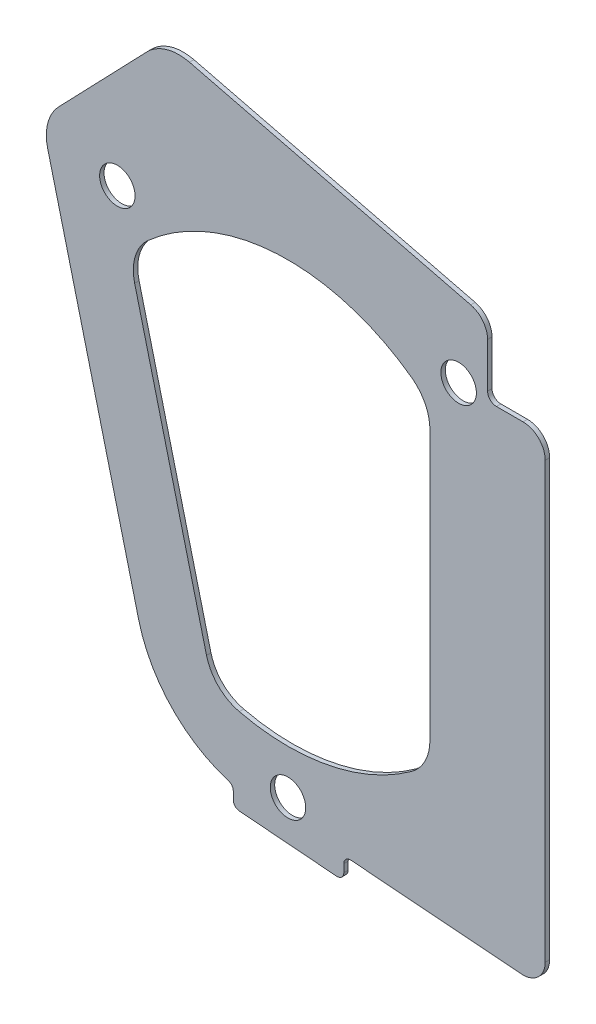
ISO-10303-21;
HEADER;
FILE_DESCRIPTION(('STEP AP214'),'2;1');
FILE_NAME('part.step','',(''),(''),'','','');
FILE_SCHEMA(('AUTOMOTIVE_DESIGN { 1 0 10303 214 1 1 1 1 }'));
ENDSEC;
DATA;
#1=APPLICATION_CONTEXT('core data for automotive mechanical design processes');
#2=APPLICATION_PROTOCOL_DEFINITION('international standard','automotive_design',2000,#1);
#3=PRODUCT_CONTEXT('',#1,'mechanical');
#4=PRODUCT('Part','Part','',(#3));
#5=PRODUCT_RELATED_PRODUCT_CATEGORY('part','',(#4));
#6=PRODUCT_DEFINITION_FORMATION('','',#4);
#7=PRODUCT_DEFINITION_CONTEXT('part definition',#1,'design');
#8=PRODUCT_DEFINITION('design','',#6,#7);
#9=PRODUCT_DEFINITION_SHAPE('','',#8);
#10=(LENGTH_UNIT() NAMED_UNIT(*) SI_UNIT(.MILLI.,.METRE.));
#11=(NAMED_UNIT(*) PLANE_ANGLE_UNIT() SI_UNIT($,.RADIAN.));
#12=(NAMED_UNIT(*) SI_UNIT($,.STERADIAN.) SOLID_ANGLE_UNIT());
#13=UNCERTAINTY_MEASURE_WITH_UNIT(LENGTH_MEASURE(1.E-05),#10,'distance_accuracy_value','');
#14=(GEOMETRIC_REPRESENTATION_CONTEXT(3) GLOBAL_UNCERTAINTY_ASSIGNED_CONTEXT((#13)) GLOBAL_UNIT_ASSIGNED_CONTEXT((#10,
#11,#12)) REPRESENTATION_CONTEXT('',''));
#15=CARTESIAN_POINT('',(0.,0.,0.));
#16=DIRECTION('',(0.,0.,1.));
#17=DIRECTION('',(1.,0.,0.));
#18=AXIS2_PLACEMENT_3D('',#15,#16,#17);
#19=CARTESIAN_POINT('',(-4.57536444130157,-32.2653428300318,1.));
#20=DIRECTION('',(0.,0.,1.));
#21=DIRECTION('',(1.,0.,0.));
#22=AXIS2_PLACEMENT_3D('',#19,#20,#21);
#23=PLANE('',#22);
#24=CARTESIAN_POINT('',(-38.4750098656341,42.7308274649504,1.));
#25=DIRECTION('',(0.,0.,1.));
#26=DIRECTION('',(1.,0.,0.));
#27=AXIS2_PLACEMENT_3D('',#24,#25,#26);
#28=CIRCLE('',#27,4.);
#29=CARTESIAN_POINT('',(-34.4750098656341,42.7308274649504,1.));
#30=VERTEX_POINT('',#29);
#31=EDGE_CURVE('E298',#30,#30,#28,.T.);
#32=ORIENTED_EDGE('',*,*,#31,.F.);
#33=EDGE_LOOP('',(#32));
#34=FACE_BOUND('',#33,.T.);
#35=CARTESIAN_POINT('',(-4.57536444130157,-32.2653428300318,1.));
#36=DIRECTION('',(0.,0.,1.));
#37=DIRECTION('',(1.,0.,0.));
#38=AXIS2_PLACEMENT_3D('',#35,#36,#37);
#39=CIRCLE('',#38,30.);
#40=CARTESIAN_POINT('',(-33.6726776296201,-39.5692024412857,1.));
#41=VERTEX_POINT('',#40);
#42=CARTESIAN_POINT('',(-13.3987657299449,-60.9384589791281,1.));
#43=VERTEX_POINT('',#42);
#44=EDGE_CURVE('E310',#41,#43,#39,.T.);
#45=ORIENTED_EDGE('',*,*,#44,.T.);
#46=CARTESIAN_POINT('',(-13.8399357943771,-62.3721147865829,1.));
#47=DIRECTION('',(0.,0.,-1.));
#48=DIRECTION('',(1.,0.,0.));
#49=AXIS2_PLACEMENT_3D('',#46,#47,#48);
#50=CIRCLE('',#49,1.49999999999999);
#51=CARTESIAN_POINT('',(-12.3399357943771,-62.3721147865829,1.));
#52=VERTEX_POINT('',#51);
#53=EDGE_CURVE('E313',#43,#52,#50,.T.);
#54=ORIENTED_EDGE('',*,*,#53,.T.);
#55=DIRECTION('',(0.,-1.,0.));
#56=VECTOR('',#55,1.);
#57=CARTESIAN_POINT('',(-12.3399357943771,-62.3721147865829,1.));
#58=LINE('',#57,#56);
#59=CARTESIAN_POINT('',(-12.3399357943771,-64.1251935577605,1.));
#60=VERTEX_POINT('',#59);
#61=EDGE_CURVE('E316',#52,#60,#58,.T.);
#62=ORIENTED_EDGE('',*,*,#61,.T.);
#63=CARTESIAN_POINT('',(-10.8399357943771,-64.1251935577605,1.));
#64=DIRECTION('',(0.,0.,1.));
#65=DIRECTION('',(1.,0.,0.));
#66=AXIS2_PLACEMENT_3D('',#63,#64,#65);
#67=CIRCLE('',#66,1.5);
#68=CARTESIAN_POINT('',(-10.9599357943771,-65.6203858530858,1.));
#69=VERTEX_POINT('',#68);
#70=EDGE_CURVE('E318',#60,#69,#67,.T.);
#71=ORIENTED_EDGE('',*,*,#70,.T.);
#72=DIRECTION('',(0.996794863550169,-0.0800000000000001,0.));
#73=VECTOR('',#72,1.);
#74=CARTESIAN_POINT('',(-10.9599357943771,-65.6203858530858,1.));
#75=LINE('',#74,#73);
#76=CARTESIAN_POINT('',(10.9599357943771,-67.3796141469142,1.));
#77=VERTEX_POINT('',#76);
#78=EDGE_CURVE('E320',#69,#77,#75,.T.);
#79=ORIENTED_EDGE('',*,*,#78,.T.);
#80=CARTESIAN_POINT('',(11.0799357943771,-65.884421851589,1.));
#81=DIRECTION('',(0.,0.,1.));
#82=DIRECTION('',(1.,0.,0.));
#83=AXIS2_PLACEMENT_3D('',#80,#81,#82);
#84=CIRCLE('',#83,1.50000000000001);
#85=CARTESIAN_POINT('',(12.5799357943771,-65.884421851589,1.));
#86=VERTEX_POINT('',#85);
#87=EDGE_CURVE('E322',#77,#86,#84,.T.);
#88=ORIENTED_EDGE('',*,*,#87,.T.);
#89=DIRECTION('',(0.,1.,0.));
#90=VECTOR('',#89,1.);
#91=CARTESIAN_POINT('',(12.5799357943771,-65.884421851589,1.));
#92=LINE('',#91,#90);
#93=CARTESIAN_POINT('',(12.5799357943771,-64.1313430804113,1.));
#94=VERTEX_POINT('',#93);
#95=EDGE_CURVE('E324',#86,#94,#92,.T.);
#96=ORIENTED_EDGE('',*,*,#95,.T.);
#97=CARTESIAN_POINT('',(14.0799357943771,-64.1313430804113,1.));
#98=DIRECTION('',(0.,0.,-1.));
#99=DIRECTION('',(-1.,0.,0.));
#100=AXIS2_PLACEMENT_3D('',#97,#98,#99);
#101=CIRCLE('',#100,1.5);
#102=CARTESIAN_POINT('',(14.1967250422869,-62.6358965679701,1.));
#103=VERTEX_POINT('',#102);
#104=EDGE_CURVE('E326',#94,#103,#101,.T.);
#105=ORIENTED_EDGE('',*,*,#104,.T.);
#106=DIRECTION('',(0.996964341627493,-0.0778594986065279,0.));
#107=VECTOR('',#106,1.);
#108=CARTESIAN_POINT('',(14.1967250422869,-62.6358965679701,1.));
#109=LINE('',#108,#107);
#110=CARTESIAN_POINT('',(52.6107025069674,-65.6358965679701,1.));
#111=VERTEX_POINT('',#110);
#112=EDGE_CURVE('E328',#103,#111,#109,.T.);
#113=ORIENTED_EDGE('',*,*,#112,.T.);
#114=CARTESIAN_POINT('',(53.,-60.6510748598326,1.));
#115=DIRECTION('',(0.,0.,1.));
#116=DIRECTION('',(1.,0.,0.));
#117=AXIS2_PLACEMENT_3D('',#114,#115,#116);
#118=CIRCLE('',#117,5.);
#119=CARTESIAN_POINT('',(58.,-60.6510748598326,1.));
#120=VERTEX_POINT('',#119);
#121=EDGE_CURVE('E330',#111,#120,#118,.T.);
#122=ORIENTED_EDGE('',*,*,#121,.T.);
#123=DIRECTION('',(0.,1.,0.));
#124=VECTOR('',#123,1.);
#125=CARTESIAN_POINT('',(58.,-60.6510748598326,1.));
#126=LINE('',#125,#124);
#127=CARTESIAN_POINT('',(58.,37.3641034320299,1.));
#128=VERTEX_POINT('',#127);
#129=EDGE_CURVE('E332',#120,#128,#126,.T.);
#130=ORIENTED_EDGE('',*,*,#129,.T.);
#131=CARTESIAN_POINT('',(53.,37.3641034320299,1.));
#132=DIRECTION('',(0.,0.,1.));
#133=DIRECTION('',(1.,0.,0.));
#134=AXIS2_PLACEMENT_3D('',#131,#132,#133);
#135=CIRCLE('',#134,5.);
#136=CARTESIAN_POINT('',(53.,42.3641034320299,1.));
#137=VERTEX_POINT('',#136);
#138=EDGE_CURVE('E334',#128,#137,#135,.T.);
#139=ORIENTED_EDGE('',*,*,#138,.T.);
#140=DIRECTION('',(-1.,0.,0.));
#141=VECTOR('',#140,1.);
#142=CARTESIAN_POINT('',(53.,42.3641034320299,1.));
#143=LINE('',#142,#141);
#144=CARTESIAN_POINT('',(47.,42.3641034320299,1.));
#145=VERTEX_POINT('',#144);
#146=EDGE_CURVE('E336',#137,#145,#143,.T.);
#147=ORIENTED_EDGE('',*,*,#146,.T.);
#148=CARTESIAN_POINT('',(47.,44.3641034320299,1.));
#149=DIRECTION('',(0.,0.,-1.));
#150=DIRECTION('',(-1.,0.,0.));
#151=AXIS2_PLACEMENT_3D('',#148,#149,#150);
#152=CIRCLE('',#151,2.);
#153=CARTESIAN_POINT('',(45.,44.3641034320299,1.));
#154=VERTEX_POINT('',#153);
#155=EDGE_CURVE('E338',#145,#154,#152,.T.);
#156=ORIENTED_EDGE('',*,*,#155,.T.);
#157=DIRECTION('',(0.,1.,0.));
#158=VECTOR('',#157,1.);
#159=CARTESIAN_POINT('',(45.,44.3641034320299,1.));
#160=LINE('',#159,#158);
#161=CARTESIAN_POINT('',(45.,54.4496966257359,1.));
#162=VERTEX_POINT('',#161);
#163=EDGE_CURVE('E340',#154,#162,#160,.T.);
#164=ORIENTED_EDGE('',*,*,#163,.T.);
#165=CARTESIAN_POINT('',(40.,54.4496966257359,1.));
#166=DIRECTION('',(0.,0.,1.));
#167=DIRECTION('',(1.,0.,0.));
#168=AXIS2_PLACEMENT_3D('',#165,#166,#167);
#169=CIRCLE('',#168,5.);
#170=CARTESIAN_POINT('',(41.2,59.3035610655405,1.));
#171=VERTEX_POINT('',#170);
#172=EDGE_CURVE('E342',#162,#171,#169,.T.);
#173=ORIENTED_EDGE('',*,*,#172,.T.);
#174=DIRECTION('',(-0.970772887960928,0.24,0.));
#175=VECTOR('',#174,1.);
#176=CARTESIAN_POINT('',(41.2,59.3035610655405,1.));
#177=LINE('',#176,#175);
#178=CARTESIAN_POINT('',(-22.2032067152073,74.9784627859748,1.));
#179=VERTEX_POINT('',#178);
#180=EDGE_CURVE('E344',#171,#179,#177,.T.);
#181=ORIENTED_EDGE('',*,*,#180,.T.);
#182=CARTESIAN_POINT('',(-24.6032067152072,65.2707339063655,1.));
#183=DIRECTION('',(0.,0.,1.));
#184=DIRECTION('',(1.,0.,0.));
#185=AXIS2_PLACEMENT_3D('',#182,#183,#184);
#186=CIRCLE('',#185,10.);
#187=CARTESIAN_POINT('',(-31.8103465380008,72.2030593152528,1.));
#188=VERTEX_POINT('',#187);
#189=EDGE_CURVE('E346',#179,#188,#186,.T.);
#190=ORIENTED_EDGE('',*,*,#189,.T.);
#191=DIRECTION('',(-0.693232540888727,-0.72071398227935,0.));
#192=VECTOR('',#191,1.);
#193=CARTESIAN_POINT('',(-31.8103465380008,72.2030593152528,1.));
#194=LINE('',#193,#192);
#195=CARTESIAN_POINT('',(-51.6963966633559,51.5286772972396,1.));
#196=VERTEX_POINT('',#195);
#197=EDGE_CURVE('E348',#188,#196,#194,.T.);
#198=ORIENTED_EDGE('',*,*,#197,.T.);
#199=CARTESIAN_POINT('',(-44.4892568405624,44.5963518883524,1.));
#200=DIRECTION('',(0.,0.,1.));
#201=DIRECTION('',(1.,0.,0.));
#202=AXIS2_PLACEMENT_3D('',#199,#200,#201);
#203=CIRCLE('',#202,10.);
#204=CARTESIAN_POINT('',(-54.1883612366686,42.1617320179344,1.));
#205=VERTEX_POINT('',#204);
#206=EDGE_CURVE('E350',#196,#205,#203,.T.);
#207=ORIENTED_EDGE('',*,*,#206,.T.);
#208=DIRECTION('',(0.243461987041799,-0.969910439610616,0.));
#209=VECTOR('',#208,1.);
#210=CARTESIAN_POINT('',(-54.1883612366686,42.1617320179344,1.));
#211=LINE('',#210,#209);
#212=EDGE_CURVE('E352',#205,#41,#211,.T.);
#213=ORIENTED_EDGE('',*,*,#212,.T.);
#214=EDGE_LOOP('',(#45,#54,#62,#71,#79,#88,#96,#105,#113,#122,#130,#139,#147,#156,#164,#173,
#181,#190,#198,#207,#213));
#215=FACE_BOUND('',#214,.T.);
#216=CARTESIAN_POINT('',(0.,-57.5,1.));
#217=DIRECTION('',(0.,0.,1.));
#218=DIRECTION('',(1.,0.,0.));
#219=AXIS2_PLACEMENT_3D('',#216,#217,#218);
#220=CIRCLE('',#219,4.);
#221=CARTESIAN_POINT('',(4.,-57.5,1.));
#222=VERTEX_POINT('',#221);
#223=EDGE_CURVE('E304',#222,#222,#220,.T.);
#224=ORIENTED_EDGE('',*,*,#223,.F.);
#225=EDGE_LOOP('',(#224));
#226=FACE_BOUND('',#225,.T.);
#227=CARTESIAN_POINT('',(38.4750098656341,42.7308274649504,1.));
#228=DIRECTION('',(0.,0.,1.));
#229=DIRECTION('',(1.,0.,0.));
#230=AXIS2_PLACEMENT_3D('',#227,#228,#229);
#231=CIRCLE('',#230,4.00000000000001);
#232=CARTESIAN_POINT('',(42.4750098656341,42.7308274649504,1.));
#233=VERTEX_POINT('',#232);
#234=EDGE_CURVE('E292',#233,#233,#231,.T.);
#235=ORIENTED_EDGE('',*,*,#234,.F.);
#236=EDGE_LOOP('',(#235));
#237=FACE_BOUND('',#236,.T.);
#238=DIRECTION('',(0.,1.,0.));
#239=VECTOR('',#238,1.);
#240=CARTESIAN_POINT('',(32.,30.3685692781204,1.));
#241=LINE('',#240,#239);
#242=CARTESIAN_POINT('',(32.,-30.3685692781204,1.));
#243=VERTEX_POINT('',#242);
#244=CARTESIAN_POINT('',(32.,30.3685692781204,1.));
#245=VERTEX_POINT('',#244);
#246=EDGE_CURVE('E235',#243,#245,#241,.T.);
#247=ORIENTED_EDGE('',*,*,#246,.F.);
#248=CARTESIAN_POINT('',(22.,-30.3685692781204,1.));
#249=DIRECTION('',(0.,0.,1.));
#250=DIRECTION('',(-1.,0.,0.));
#251=AXIS2_PLACEMENT_3D('',#248,#249,#250);
#252=CIRCLE('',#251,10.);
#253=CARTESIAN_POINT('',(27.8666666666667,-38.4668544189525,1.));
#254=VERTEX_POINT('',#253);
#255=EDGE_CURVE('E227',#254,#243,#252,.T.);
#256=ORIENTED_EDGE('',*,*,#255,.F.);
#257=CARTESIAN_POINT('',(0.,0.,1.));
#258=DIRECTION('',(0.,0.,1.));
#259=DIRECTION('',(1.,0.,0.));
#260=AXIS2_PLACEMENT_3D('',#257,#258,#259);
#261=CIRCLE('',#260,47.5);
#262=CARTESIAN_POINT('',(-10.9840713129822,-46.2125543266256,1.));
#263=VERTEX_POINT('',#262);
#264=EDGE_CURVE('E260',#263,#254,#261,.T.);
#265=ORIENTED_EDGE('',*,*,#264,.F.);
#266=CARTESIAN_POINT('',(-8.67163524709119,-36.4835955210202,1.));
#267=DIRECTION('',(0.,0.,1.));
#268=DIRECTION('',(1.,0.,0.));
#269=AXIS2_PLACEMENT_3D('',#266,#267,#268);
#270=CIRCLE('',#269,10.);
#271=CARTESIAN_POINT('',(-18.3707396431974,-38.9182153914382,1.));
#272=VERTEX_POINT('',#271);
#273=EDGE_CURVE('E258',#272,#263,#270,.T.);
#274=ORIENTED_EDGE('',*,*,#273,.F.);
#275=DIRECTION('',(0.243461987041799,-0.969910439610616,0.));
#276=VECTOR('',#275,1.);
#277=CARTESIAN_POINT('',(-34.5729433357523,25.6285612821981,1.));
#278=LINE('',#277,#276);
#279=CARTESIAN_POINT('',(-34.5729433357523,25.628561282198,1.));
#280=VERTEX_POINT('',#279);
#281=EDGE_CURVE('E256',#280,#272,#278,.T.);
#282=ORIENTED_EDGE('',*,*,#281,.F.);
#283=CARTESIAN_POINT('',(-24.8738389396461,28.063181152616,1.));
#284=DIRECTION('',(0.,0.,1.));
#285=DIRECTION('',(-1.,0.,0.));
#286=AXIS2_PLACEMENT_3D('',#283,#284,#285);
#287=CIRCLE('',#286,10.);
#288=CARTESIAN_POINT('',(-31.5068626568851,35.546696126647,1.));
#289=VERTEX_POINT('',#288);
#290=EDGE_CURVE('E254',#289,#280,#287,.T.);
#291=ORIENTED_EDGE('',*,*,#290,.F.);
#292=CARTESIAN_POINT('',(0.,0.,1.));
#293=DIRECTION('',(0.,0.,1.));
#294=DIRECTION('',(1.,0.,0.));
#295=AXIS2_PLACEMENT_3D('',#292,#293,#294);
#296=CIRCLE('',#295,47.5);
#297=CARTESIAN_POINT('',(27.8666666666667,38.4668544189525,1.));
#298=VERTEX_POINT('',#297);
#299=EDGE_CURVE('E250',#298,#289,#296,.T.);
#300=ORIENTED_EDGE('',*,*,#299,.F.);
#301=CARTESIAN_POINT('',(22.,30.3685692781204,1.));
#302=DIRECTION('',(0.,0.,1.));
#303=DIRECTION('',(1.,0.,0.));
#304=AXIS2_PLACEMENT_3D('',#301,#302,#303);
#305=CIRCLE('',#304,10.);
#306=EDGE_CURVE('E248',#245,#298,#305,.T.);
#307=ORIENTED_EDGE('',*,*,#306,.F.);
#308=EDGE_LOOP('',(#247,#256,#265,#274,#282,#291,#300,#307));
#309=FACE_BOUND('',#308,.T.);
#310=ADVANCED_FACE('F36',(#34,#215,#226,#237,#309),#23,.T.);
#311=CARTESIAN_POINT('',(-4.57536444130157,-32.2653428300318,0.));
#312=DIRECTION('',(0.,0.,1.));
#313=DIRECTION('',(1.,0.,0.));
#314=AXIS2_PLACEMENT_3D('',#311,#312,#313);
#315=PLANE('',#314);
#316=CARTESIAN_POINT('',(38.4750098656341,42.7308274649504,0.));
#317=DIRECTION('',(0.,0.,1.));
#318=DIRECTION('',(1.,0.,0.));
#319=AXIS2_PLACEMENT_3D('',#316,#317,#318);
#320=CIRCLE('',#319,4.00000000000001);
#321=CARTESIAN_POINT('',(42.4750098656341,42.7308274649504,0.));
#322=VERTEX_POINT('',#321);
#323=EDGE_CURVE('E243',#322,#322,#320,.T.);
#324=ORIENTED_EDGE('',*,*,#323,.T.);
#325=EDGE_LOOP('',(#324));
#326=FACE_BOUND('',#325,.T.);
#327=CARTESIAN_POINT('',(-38.4750098656341,42.7308274649504,0.));
#328=DIRECTION('',(0.,0.,1.));
#329=DIRECTION('',(1.,0.,0.));
#330=AXIS2_PLACEMENT_3D('',#327,#328,#329);
#331=CIRCLE('',#330,4.);
#332=CARTESIAN_POINT('',(-34.4750098656341,42.7308274649504,0.));
#333=VERTEX_POINT('',#332);
#334=EDGE_CURVE('E295',#333,#333,#331,.T.);
#335=ORIENTED_EDGE('',*,*,#334,.T.);
#336=EDGE_LOOP('',(#335));
#337=FACE_BOUND('',#336,.T.);
#338=CARTESIAN_POINT('',(0.,-57.5,0.));
#339=DIRECTION('',(0.,0.,1.));
#340=DIRECTION('',(1.,0.,0.));
#341=AXIS2_PLACEMENT_3D('',#338,#339,#340);
#342=CIRCLE('',#341,4.);
#343=CARTESIAN_POINT('',(4.,-57.5,0.));
#344=VERTEX_POINT('',#343);
#345=EDGE_CURVE('E301',#344,#344,#342,.T.);
#346=ORIENTED_EDGE('',*,*,#345,.T.);
#347=EDGE_LOOP('',(#346));
#348=FACE_BOUND('',#347,.T.);
#349=CARTESIAN_POINT('',(-4.57536444130157,-32.2653428300318,0.));
#350=DIRECTION('',(0.,0.,1.));
#351=DIRECTION('',(1.,0.,0.));
#352=AXIS2_PLACEMENT_3D('',#349,#350,#351);
#353=CIRCLE('',#352,30.);
#354=CARTESIAN_POINT('',(-33.6726776296201,-39.5692024412857,0.));
#355=VERTEX_POINT('',#354);
#356=CARTESIAN_POINT('',(-13.3987657299449,-60.9384589791281,0.));
#357=VERTEX_POINT('',#356);
#358=EDGE_CURVE('E307',#355,#357,#353,.T.);
#359=ORIENTED_EDGE('',*,*,#358,.F.);
#360=DIRECTION('',(0.243461987041799,-0.969910439610616,0.));
#361=VECTOR('',#360,1.);
#362=CARTESIAN_POINT('',(-54.1883612366686,42.1617320179344,0.));
#363=LINE('',#362,#361);
#364=CARTESIAN_POINT('',(-54.1883612366686,42.1617320179344,0.));
#365=VERTEX_POINT('',#364);
#366=EDGE_CURVE('E314',#365,#355,#363,.T.);
#367=ORIENTED_EDGE('',*,*,#366,.F.);
#368=CARTESIAN_POINT('',(-44.4892568405624,44.5963518883524,0.));
#369=DIRECTION('',(0.,0.,1.));
#370=DIRECTION('',(1.,0.,0.));
#371=AXIS2_PLACEMENT_3D('',#368,#369,#370);
#372=CIRCLE('',#371,10.);
#373=CARTESIAN_POINT('',(-51.6963966633559,51.5286772972396,0.));
#374=VERTEX_POINT('',#373);
#375=EDGE_CURVE('E393',#374,#365,#372,.T.);
#376=ORIENTED_EDGE('',*,*,#375,.F.);
#377=DIRECTION('',(-0.693232540888727,-0.72071398227935,0.));
#378=VECTOR('',#377,1.);
#379=CARTESIAN_POINT('',(-31.8103465380008,72.2030593152528,0.));
#380=LINE('',#379,#378);
#381=CARTESIAN_POINT('',(-31.8103465380008,72.2030593152528,0.));
#382=VERTEX_POINT('',#381);
#383=EDGE_CURVE('E391',#382,#374,#380,.T.);
#384=ORIENTED_EDGE('',*,*,#383,.F.);
#385=CARTESIAN_POINT('',(-24.6032067152072,65.2707339063655,0.));
#386=DIRECTION('',(0.,0.,1.));
#387=DIRECTION('',(1.,0.,0.));
#388=AXIS2_PLACEMENT_3D('',#385,#386,#387);
#389=CIRCLE('',#388,10.);
#390=CARTESIAN_POINT('',(-22.2032067152073,74.9784627859748,0.));
#391=VERTEX_POINT('',#390);
#392=EDGE_CURVE('E389',#391,#382,#389,.T.);
#393=ORIENTED_EDGE('',*,*,#392,.F.);
#394=DIRECTION('',(-0.970772887960928,0.24,0.));
#395=VECTOR('',#394,1.);
#396=CARTESIAN_POINT('',(41.2,59.3035610655405,0.));
#397=LINE('',#396,#395);
#398=CARTESIAN_POINT('',(41.2,59.3035610655405,0.));
#399=VERTEX_POINT('',#398);
#400=EDGE_CURVE('E387',#399,#391,#397,.T.);
#401=ORIENTED_EDGE('',*,*,#400,.F.);
#402=CARTESIAN_POINT('',(40.,54.4496966257359,0.));
#403=DIRECTION('',(0.,0.,1.));
#404=DIRECTION('',(1.,0.,0.));
#405=AXIS2_PLACEMENT_3D('',#402,#403,#404);
#406=CIRCLE('',#405,5.);
#407=CARTESIAN_POINT('',(45.,54.4496966257359,0.));
#408=VERTEX_POINT('',#407);
#409=EDGE_CURVE('E385',#408,#399,#406,.T.);
#410=ORIENTED_EDGE('',*,*,#409,.F.);
#411=DIRECTION('',(0.,1.,0.));
#412=VECTOR('',#411,1.);
#413=CARTESIAN_POINT('',(45.,44.3641034320299,0.));
#414=LINE('',#413,#412);
#415=CARTESIAN_POINT('',(45.,44.3641034320299,0.));
#416=VERTEX_POINT('',#415);
#417=EDGE_CURVE('E383',#416,#408,#414,.T.);
#418=ORIENTED_EDGE('',*,*,#417,.F.);
#419=CARTESIAN_POINT('',(47.,44.3641034320299,0.));
#420=DIRECTION('',(0.,0.,-1.));
#421=DIRECTION('',(-1.,0.,0.));
#422=AXIS2_PLACEMENT_3D('',#419,#420,#421);
#423=CIRCLE('',#422,2.);
#424=CARTESIAN_POINT('',(47.,42.3641034320299,0.));
#425=VERTEX_POINT('',#424);
#426=EDGE_CURVE('E381',#425,#416,#423,.T.);
#427=ORIENTED_EDGE('',*,*,#426,.F.);
#428=DIRECTION('',(-1.,0.,0.));
#429=VECTOR('',#428,1.);
#430=CARTESIAN_POINT('',(53.,42.3641034320299,0.));
#431=LINE('',#430,#429);
#432=CARTESIAN_POINT('',(53.,42.3641034320299,0.));
#433=VERTEX_POINT('',#432);
#434=EDGE_CURVE('E379',#433,#425,#431,.T.);
#435=ORIENTED_EDGE('',*,*,#434,.F.);
#436=CARTESIAN_POINT('',(53.,37.3641034320299,0.));
#437=DIRECTION('',(0.,0.,1.));
#438=DIRECTION('',(1.,0.,0.));
#439=AXIS2_PLACEMENT_3D('',#436,#437,#438);
#440=CIRCLE('',#439,5.);
#441=CARTESIAN_POINT('',(58.,37.3641034320299,0.));
#442=VERTEX_POINT('',#441);
#443=EDGE_CURVE('E377',#442,#433,#440,.T.);
#444=ORIENTED_EDGE('',*,*,#443,.F.);
#445=DIRECTION('',(0.,1.,0.));
#446=VECTOR('',#445,1.);
#447=CARTESIAN_POINT('',(58.,-60.6510748598326,0.));
#448=LINE('',#447,#446);
#449=CARTESIAN_POINT('',(58.,-60.6510748598326,0.));
#450=VERTEX_POINT('',#449);
#451=EDGE_CURVE('E375',#450,#442,#448,.T.);
#452=ORIENTED_EDGE('',*,*,#451,.F.);
#453=CARTESIAN_POINT('',(53.,-60.6510748598326,0.));
#454=DIRECTION('',(0.,0.,1.));
#455=DIRECTION('',(1.,0.,0.));
#456=AXIS2_PLACEMENT_3D('',#453,#454,#455);
#457=CIRCLE('',#456,5.);
#458=CARTESIAN_POINT('',(52.6107025069674,-65.6358965679701,0.));
#459=VERTEX_POINT('',#458);
#460=EDGE_CURVE('E373',#459,#450,#457,.T.);
#461=ORIENTED_EDGE('',*,*,#460,.F.);
#462=DIRECTION('',(0.996964341627493,-0.0778594986065279,0.));
#463=VECTOR('',#462,1.);
#464=CARTESIAN_POINT('',(14.1967250422869,-62.6358965679701,0.));
#465=LINE('',#464,#463);
#466=CARTESIAN_POINT('',(14.1967250422869,-62.6358965679701,0.));
#467=VERTEX_POINT('',#466);
#468=EDGE_CURVE('E371',#467,#459,#465,.T.);
#469=ORIENTED_EDGE('',*,*,#468,.F.);
#470=CARTESIAN_POINT('',(14.0799357943771,-64.1313430804113,0.));
#471=DIRECTION('',(0.,0.,-1.));
#472=DIRECTION('',(-1.,0.,0.));
#473=AXIS2_PLACEMENT_3D('',#470,#471,#472);
#474=CIRCLE('',#473,1.5);
#475=CARTESIAN_POINT('',(12.5799357943771,-64.1313430804113,0.));
#476=VERTEX_POINT('',#475);
#477=EDGE_CURVE('E369',#476,#467,#474,.T.);
#478=ORIENTED_EDGE('',*,*,#477,.F.);
#479=DIRECTION('',(0.,1.,0.));
#480=VECTOR('',#479,1.);
#481=CARTESIAN_POINT('',(12.5799357943771,-65.884421851589,0.));
#482=LINE('',#481,#480);
#483=CARTESIAN_POINT('',(12.5799357943771,-65.884421851589,0.));
#484=VERTEX_POINT('',#483);
#485=EDGE_CURVE('E367',#484,#476,#482,.T.);
#486=ORIENTED_EDGE('',*,*,#485,.F.);
#487=CARTESIAN_POINT('',(11.0799357943771,-65.884421851589,0.));
#488=DIRECTION('',(0.,0.,1.));
#489=DIRECTION('',(1.,0.,0.));
#490=AXIS2_PLACEMENT_3D('',#487,#488,#489);
#491=CIRCLE('',#490,1.50000000000001);
#492=CARTESIAN_POINT('',(10.9599357943771,-67.3796141469142,0.));
#493=VERTEX_POINT('',#492);
#494=EDGE_CURVE('E365',#493,#484,#491,.T.);
#495=ORIENTED_EDGE('',*,*,#494,.F.);
#496=DIRECTION('',(0.996794863550169,-0.0800000000000001,0.));
#497=VECTOR('',#496,1.);
#498=CARTESIAN_POINT('',(-10.9599357943771,-65.6203858530858,0.));
#499=LINE('',#498,#497);
#500=CARTESIAN_POINT('',(-10.9599357943771,-65.6203858530858,0.));
#501=VERTEX_POINT('',#500);
#502=EDGE_CURVE('E363',#501,#493,#499,.T.);
#503=ORIENTED_EDGE('',*,*,#502,.F.);
#504=CARTESIAN_POINT('',(-10.8399357943771,-64.1251935577605,0.));
#505=DIRECTION('',(0.,0.,1.));
#506=DIRECTION('',(1.,0.,0.));
#507=AXIS2_PLACEMENT_3D('',#504,#505,#506);
#508=CIRCLE('',#507,1.5);
#509=CARTESIAN_POINT('',(-12.3399357943771,-64.1251935577605,0.));
#510=VERTEX_POINT('',#509);
#511=EDGE_CURVE('E361',#510,#501,#508,.T.);
#512=ORIENTED_EDGE('',*,*,#511,.F.);
#513=DIRECTION('',(0.,-1.,0.));
#514=VECTOR('',#513,1.);
#515=CARTESIAN_POINT('',(-12.3399357943771,-62.3721147865829,0.));
#516=LINE('',#515,#514);
#517=CARTESIAN_POINT('',(-12.3399357943771,-62.3721147865829,0.));
#518=VERTEX_POINT('',#517);
#519=EDGE_CURVE('E359',#518,#510,#516,.T.);
#520=ORIENTED_EDGE('',*,*,#519,.F.);
#521=CARTESIAN_POINT('',(-13.8399357943771,-62.3721147865829,0.));
#522=DIRECTION('',(0.,0.,-1.));
#523=DIRECTION('',(1.,0.,0.));
#524=AXIS2_PLACEMENT_3D('',#521,#522,#523);
#525=CIRCLE('',#524,1.49999999999999);
#526=EDGE_CURVE('E357',#357,#518,#525,.T.);
#527=ORIENTED_EDGE('',*,*,#526,.F.);
#528=EDGE_LOOP('',(#359,#367,#376,#384,#393,#401,#410,#418,#427,#435,#444,#452,#461,#469,#478,
#486,#495,#503,#512,#520,#527));
#529=FACE_BOUND('',#528,.T.);
#530=CARTESIAN_POINT('',(22.,-30.3685692781204,0.));
#531=DIRECTION('',(0.,0.,1.));
#532=DIRECTION('',(-1.,0.,0.));
#533=AXIS2_PLACEMENT_3D('',#530,#531,#532);
#534=CIRCLE('',#533,10.);
#535=CARTESIAN_POINT('',(27.8666666666667,-38.4668544189525,0.));
#536=VERTEX_POINT('',#535);
#537=CARTESIAN_POINT('',(32.,-30.3685692781204,0.));
#538=VERTEX_POINT('',#537);
#539=EDGE_CURVE('E59',#536,#538,#534,.T.);
#540=ORIENTED_EDGE('',*,*,#539,.T.);
#541=DIRECTION('',(0.,1.,0.));
#542=VECTOR('',#541,1.);
#543=CARTESIAN_POINT('',(32.,30.3685692781204,0.));
#544=LINE('',#543,#542);
#545=CARTESIAN_POINT('',(32.,30.3685692781204,0.));
#546=VERTEX_POINT('',#545);
#547=EDGE_CURVE('E242',#538,#546,#544,.T.);
#548=ORIENTED_EDGE('',*,*,#547,.T.);
#549=CARTESIAN_POINT('',(22.,30.3685692781204,0.));
#550=DIRECTION('',(0.,0.,1.));
#551=DIRECTION('',(1.,0.,0.));
#552=AXIS2_PLACEMENT_3D('',#549,#550,#551);
#553=CIRCLE('',#552,10.);
#554=CARTESIAN_POINT('',(27.8666666666667,38.4668544189525,0.));
#555=VERTEX_POINT('',#554);
#556=EDGE_CURVE('E264',#546,#555,#553,.T.);
#557=ORIENTED_EDGE('',*,*,#556,.T.);
#558=CARTESIAN_POINT('',(0.,0.,0.));
#559=DIRECTION('',(0.,0.,1.));
#560=DIRECTION('',(1.,0.,0.));
#561=AXIS2_PLACEMENT_3D('',#558,#559,#560);
#562=CIRCLE('',#561,47.5);
#563=CARTESIAN_POINT('',(-31.5068626568851,35.546696126647,0.));
#564=VERTEX_POINT('',#563);
#565=EDGE_CURVE('E267',#555,#564,#562,.T.);
#566=ORIENTED_EDGE('',*,*,#565,.T.);
#567=CARTESIAN_POINT('',(-24.8738389396461,28.063181152616,0.));
#568=DIRECTION('',(0.,0.,1.));
#569=DIRECTION('',(-1.,0.,0.));
#570=AXIS2_PLACEMENT_3D('',#567,#568,#569);
#571=CIRCLE('',#570,10.);
#572=CARTESIAN_POINT('',(-34.5729433357523,25.628561282198,0.));
#573=VERTEX_POINT('',#572);
#574=EDGE_CURVE('E270',#564,#573,#571,.T.);
#575=ORIENTED_EDGE('',*,*,#574,.T.);
#576=DIRECTION('',(0.243461987041799,-0.969910439610616,0.));
#577=VECTOR('',#576,1.);
#578=CARTESIAN_POINT('',(-34.5729433357523,25.6285612821981,0.));
#579=LINE('',#578,#577);
#580=CARTESIAN_POINT('',(-18.3707396431974,-38.9182153914382,0.));
#581=VERTEX_POINT('',#580);
#582=EDGE_CURVE('E273',#573,#581,#579,.T.);
#583=ORIENTED_EDGE('',*,*,#582,.T.);
#584=CARTESIAN_POINT('',(-8.67163524709119,-36.4835955210202,0.));
#585=DIRECTION('',(0.,0.,1.));
#586=DIRECTION('',(1.,0.,0.));
#587=AXIS2_PLACEMENT_3D('',#584,#585,#586);
#588=CIRCLE('',#587,10.);
#589=CARTESIAN_POINT('',(-10.9840713129822,-46.2125543266256,0.));
#590=VERTEX_POINT('',#589);
#591=EDGE_CURVE('E276',#581,#590,#588,.T.);
#592=ORIENTED_EDGE('',*,*,#591,.T.);
#593=CARTESIAN_POINT('',(0.,0.,0.));
#594=DIRECTION('',(0.,0.,1.));
#595=DIRECTION('',(1.,0.,0.));
#596=AXIS2_PLACEMENT_3D('',#593,#594,#595);
#597=CIRCLE('',#596,47.5);
#598=EDGE_CURVE('E236',#590,#536,#597,.T.);
#599=ORIENTED_EDGE('',*,*,#598,.T.);
#600=EDGE_LOOP('',(#540,#548,#557,#566,#575,#583,#592,#599));
#601=FACE_BOUND('',#600,.T.);
#602=ADVANCED_FACE('F462',(#326,#337,#348,#529,#601),#315,.F.);
#603=CARTESIAN_POINT('',(-4.57536444130157,-32.2653428300318,1.));
#604=DIRECTION('',(0.,0.,-1.));
#605=DIRECTION('',(-1.,0.,0.));
#606=AXIS2_PLACEMENT_3D('',#603,#604,#605);
#607=CYLINDRICAL_SURFACE('',#606,30.);
#608=ORIENTED_EDGE('',*,*,#358,.T.);
#609=DIRECTION('',(0.,0.,-1.));
#610=VECTOR('',#609,1.);
#611=CARTESIAN_POINT('',(-13.3987657299449,-60.9384589791281,1.));
#612=LINE('',#611,#610);
#613=EDGE_CURVE('E11',#43,#357,#612,.T.);
#614=ORIENTED_EDGE('',*,*,#613,.F.);
#615=ORIENTED_EDGE('',*,*,#44,.F.);
#616=DIRECTION('',(0.,0.,-1.));
#617=VECTOR('',#616,1.);
#618=CARTESIAN_POINT('',(-33.6726776296201,-39.5692024412857,1.));
#619=LINE('',#618,#617);
#620=EDGE_CURVE('E354',#41,#355,#619,.T.);
#621=ORIENTED_EDGE('',*,*,#620,.T.);
#622=EDGE_LOOP('',(#608,#614,#615,#621));
#623=FACE_BOUND('',#622,.T.);
#624=ADVANCED_FACE('F38',(#623),#607,.T.);
#625=CARTESIAN_POINT('',(-13.8399357943771,-62.3721147865829,1.));
#626=DIRECTION('',(0.,0.,-1.));
#627=DIRECTION('',(-1.,0.,0.));
#628=AXIS2_PLACEMENT_3D('',#625,#626,#627);
#629=CYLINDRICAL_SURFACE('',#628,1.49999999999999);
#630=ORIENTED_EDGE('',*,*,#526,.T.);
#631=DIRECTION('',(0.,0.,-1.));
#632=VECTOR('',#631,1.);
#633=CARTESIAN_POINT('',(-12.3399357943771,-62.3721147865829,1.));
#634=LINE('',#633,#632);
#635=EDGE_CURVE('E44',#52,#518,#634,.T.);
#636=ORIENTED_EDGE('',*,*,#635,.F.);
#637=ORIENTED_EDGE('',*,*,#53,.F.);
#638=ORIENTED_EDGE('',*,*,#613,.T.);
#639=EDGE_LOOP('',(#630,#636,#637,#638));
#640=FACE_BOUND('',#639,.T.);
#641=ADVANCED_FACE('F480',(#640),#629,.F.);
#642=CARTESIAN_POINT('',(-12.3399357943771,-62.3721147865829,1.));
#643=DIRECTION('',(1.,0.,0.));
#644=DIRECTION('',(0.,1.,0.));
#645=AXIS2_PLACEMENT_3D('',#642,#643,#644);
#646=PLANE('',#645);
#647=ORIENTED_EDGE('',*,*,#519,.T.);
#648=DIRECTION('',(0.,0.,-1.));
#649=VECTOR('',#648,1.);
#650=CARTESIAN_POINT('',(-12.3399357943771,-64.1251935577605,1.));
#651=LINE('',#650,#649);
#652=EDGE_CURVE('E449',#60,#510,#651,.T.);
#653=ORIENTED_EDGE('',*,*,#652,.F.);
#654=ORIENTED_EDGE('',*,*,#61,.F.);
#655=ORIENTED_EDGE('',*,*,#635,.T.);
#656=EDGE_LOOP('',(#647,#653,#654,#655));
#657=FACE_BOUND('',#656,.T.);
#658=ADVANCED_FACE('F456',(#657),#646,.F.);
#659=CARTESIAN_POINT('',(-10.8399357943771,-64.1251935577605,1.));
#660=DIRECTION('',(0.,0.,-1.));
#661=DIRECTION('',(-1.,0.,0.));
#662=AXIS2_PLACEMENT_3D('',#659,#660,#661);
#663=CYLINDRICAL_SURFACE('',#662,1.5);
#664=ORIENTED_EDGE('',*,*,#511,.T.);
#665=DIRECTION('',(0.,0.,-1.));
#666=VECTOR('',#665,1.);
#667=CARTESIAN_POINT('',(-10.9599357943771,-65.6203858530858,1.));
#668=LINE('',#667,#666);
#669=EDGE_CURVE('E446',#69,#501,#668,.T.);
#670=ORIENTED_EDGE('',*,*,#669,.F.);
#671=ORIENTED_EDGE('',*,*,#70,.F.);
#672=ORIENTED_EDGE('',*,*,#652,.T.);
#673=EDGE_LOOP('',(#664,#670,#671,#672));
#674=FACE_BOUND('',#673,.T.);
#675=ADVANCED_FACE('F468',(#674),#663,.T.);
#676=CARTESIAN_POINT('',(-10.9599357943771,-65.6203858530858,1.));
#677=DIRECTION('',(0.0800000000000001,0.996794863550169,0.));
#678=DIRECTION('',(-0.996794863550169,0.0800000000000001,0.));
#679=AXIS2_PLACEMENT_3D('',#676,#677,#678);
#680=PLANE('',#679);
#681=ORIENTED_EDGE('',*,*,#502,.T.);
#682=DIRECTION('',(0.,0.,-1.));
#683=VECTOR('',#682,1.);
#684=CARTESIAN_POINT('',(10.9599357943771,-67.3796141469142,1.));
#685=LINE('',#684,#683);
#686=EDGE_CURVE('E443',#77,#493,#685,.T.);
#687=ORIENTED_EDGE('',*,*,#686,.F.);
#688=ORIENTED_EDGE('',*,*,#78,.F.);
#689=ORIENTED_EDGE('',*,*,#669,.T.);
#690=EDGE_LOOP('',(#681,#687,#688,#689));
#691=FACE_BOUND('',#690,.T.);
#692=ADVANCED_FACE('F472',(#691),#680,.F.);
#693=CARTESIAN_POINT('',(11.0799357943771,-65.884421851589,1.));
#694=DIRECTION('',(0.,0.,-1.));
#695=DIRECTION('',(-1.,0.,0.));
#696=AXIS2_PLACEMENT_3D('',#693,#694,#695);
#697=CYLINDRICAL_SURFACE('',#696,1.50000000000001);
#698=ORIENTED_EDGE('',*,*,#494,.T.);
#699=DIRECTION('',(0.,0.,-1.));
#700=VECTOR('',#699,1.);
#701=CARTESIAN_POINT('',(12.5799357943771,-65.884421851589,1.));
#702=LINE('',#701,#700);
#703=EDGE_CURVE('E440',#86,#484,#702,.T.);
#704=ORIENTED_EDGE('',*,*,#703,.F.);
#705=ORIENTED_EDGE('',*,*,#87,.F.);
#706=ORIENTED_EDGE('',*,*,#686,.T.);
#707=EDGE_LOOP('',(#698,#704,#705,#706));
#708=FACE_BOUND('',#707,.T.);
#709=ADVANCED_FACE('F558',(#708),#697,.T.);
#710=CARTESIAN_POINT('',(12.5799357943771,-65.884421851589,1.));
#711=DIRECTION('',(-1.,0.,0.));
#712=DIRECTION('',(0.,-1.,0.));
#713=AXIS2_PLACEMENT_3D('',#710,#711,#712);
#714=PLANE('',#713);
#715=ORIENTED_EDGE('',*,*,#485,.T.);
#716=DIRECTION('',(0.,0.,-1.));
#717=VECTOR('',#716,1.);
#718=CARTESIAN_POINT('',(12.5799357943771,-64.1313430804113,1.));
#719=LINE('',#718,#717);
#720=EDGE_CURVE('E437',#94,#476,#719,.T.);
#721=ORIENTED_EDGE('',*,*,#720,.F.);
#722=ORIENTED_EDGE('',*,*,#95,.F.);
#723=ORIENTED_EDGE('',*,*,#703,.T.);
#724=EDGE_LOOP('',(#715,#721,#722,#723));
#725=FACE_BOUND('',#724,.T.);
#726=ADVANCED_FACE('F556',(#725),#714,.F.);
#727=CARTESIAN_POINT('',(14.0799357943771,-64.1313430804113,1.));
#728=DIRECTION('',(0.,0.,-1.));
#729=DIRECTION('',(-1.,0.,0.));
#730=AXIS2_PLACEMENT_3D('',#727,#728,#729);
#731=CYLINDRICAL_SURFACE('',#730,1.5);
#732=ORIENTED_EDGE('',*,*,#477,.T.);
#733=DIRECTION('',(0.,0.,-1.));
#734=VECTOR('',#733,1.);
#735=CARTESIAN_POINT('',(14.1967250422869,-62.6358965679701,1.));
#736=LINE('',#735,#734);
#737=EDGE_CURVE('E434',#103,#467,#736,.T.);
#738=ORIENTED_EDGE('',*,*,#737,.F.);
#739=ORIENTED_EDGE('',*,*,#104,.F.);
#740=ORIENTED_EDGE('',*,*,#720,.T.);
#741=EDGE_LOOP('',(#732,#738,#739,#740));
#742=FACE_BOUND('',#741,.T.);
#743=ADVANCED_FACE('F552',(#742),#731,.F.);
#744=CARTESIAN_POINT('',(14.1967250422869,-62.6358965679701,1.));
#745=DIRECTION('',(0.0778594986065278,0.996964341627493,0.));
#746=DIRECTION('',(-0.996964341627493,0.0778594986065279,0.));
#747=AXIS2_PLACEMENT_3D('',#744,#745,#746);
#748=PLANE('',#747);
#749=ORIENTED_EDGE('',*,*,#468,.T.);
#750=DIRECTION('',(0.,0.,-1.));
#751=VECTOR('',#750,1.);
#752=CARTESIAN_POINT('',(52.6107025069674,-65.6358965679701,1.));
#753=LINE('',#752,#751);
#754=EDGE_CURVE('E431',#111,#459,#753,.T.);
#755=ORIENTED_EDGE('',*,*,#754,.F.);
#756=ORIENTED_EDGE('',*,*,#112,.F.);
#757=ORIENTED_EDGE('',*,*,#737,.T.);
#758=EDGE_LOOP('',(#749,#755,#756,#757));
#759=FACE_BOUND('',#758,.T.);
#760=ADVANCED_FACE('F547',(#759),#748,.F.);
#761=CARTESIAN_POINT('',(53.,-60.6510748598326,1.));
#762=DIRECTION('',(0.,0.,-1.));
#763=DIRECTION('',(-1.,0.,0.));
#764=AXIS2_PLACEMENT_3D('',#761,#762,#763);
#765=CYLINDRICAL_SURFACE('',#764,5.);
#766=ORIENTED_EDGE('',*,*,#460,.T.);
#767=DIRECTION('',(0.,0.,-1.));
#768=VECTOR('',#767,1.);
#769=CARTESIAN_POINT('',(58.,-60.6510748598326,1.));
#770=LINE('',#769,#768);
#771=EDGE_CURVE('E428',#120,#450,#770,.T.);
#772=ORIENTED_EDGE('',*,*,#771,.F.);
#773=ORIENTED_EDGE('',*,*,#121,.F.);
#774=ORIENTED_EDGE('',*,*,#754,.T.);
#775=EDGE_LOOP('',(#766,#772,#773,#774));
#776=FACE_BOUND('',#775,.T.);
#777=ADVANCED_FACE('F541',(#776),#765,.T.);
#778=CARTESIAN_POINT('',(58.,-60.6510748598326,1.));
#779=DIRECTION('',(-1.,0.,0.));
#780=DIRECTION('',(0.,0.,1.));
#781=AXIS2_PLACEMENT_3D('',#778,#779,#780);
#782=PLANE('',#781);
#783=ORIENTED_EDGE('',*,*,#451,.T.);
#784=DIRECTION('',(0.,0.,-1.));
#785=VECTOR('',#784,1.);
#786=CARTESIAN_POINT('',(58.,37.3641034320299,1.));
#787=LINE('',#786,#785);
#788=EDGE_CURVE('E425',#128,#442,#787,.T.);
#789=ORIENTED_EDGE('',*,*,#788,.F.);
#790=ORIENTED_EDGE('',*,*,#129,.F.);
#791=ORIENTED_EDGE('',*,*,#771,.T.);
#792=EDGE_LOOP('',(#783,#789,#790,#791));
#793=FACE_BOUND('',#792,.T.);
#794=ADVANCED_FACE('F537',(#793),#782,.F.);
#795=CARTESIAN_POINT('',(53.,37.3641034320299,1.));
#796=DIRECTION('',(0.,0.,-1.));
#797=DIRECTION('',(-1.,0.,0.));
#798=AXIS2_PLACEMENT_3D('',#795,#796,#797);
#799=CYLINDRICAL_SURFACE('',#798,5.);
#800=ORIENTED_EDGE('',*,*,#443,.T.);
#801=DIRECTION('',(0.,0.,-1.));
#802=VECTOR('',#801,1.);
#803=CARTESIAN_POINT('',(53.,42.3641034320299,1.));
#804=LINE('',#803,#802);
#805=EDGE_CURVE('E422',#137,#433,#804,.T.);
#806=ORIENTED_EDGE('',*,*,#805,.F.);
#807=ORIENTED_EDGE('',*,*,#138,.F.);
#808=ORIENTED_EDGE('',*,*,#788,.T.);
#809=EDGE_LOOP('',(#800,#806,#807,#808));
#810=FACE_BOUND('',#809,.T.);
#811=ADVANCED_FACE('F532',(#810),#799,.T.);
#812=CARTESIAN_POINT('',(53.,42.3641034320299,1.));
#813=DIRECTION('',(0.,-1.,0.));
#814=DIRECTION('',(1.,0.,0.));
#815=AXIS2_PLACEMENT_3D('',#812,#813,#814);
#816=PLANE('',#815);
#817=ORIENTED_EDGE('',*,*,#434,.T.);
#818=DIRECTION('',(0.,0.,-1.));
#819=VECTOR('',#818,1.);
#820=CARTESIAN_POINT('',(47.,42.3641034320299,1.));
#821=LINE('',#820,#819);
#822=EDGE_CURVE('E419',#145,#425,#821,.T.);
#823=ORIENTED_EDGE('',*,*,#822,.F.);
#824=ORIENTED_EDGE('',*,*,#146,.F.);
#825=ORIENTED_EDGE('',*,*,#805,.T.);
#826=EDGE_LOOP('',(#817,#823,#824,#825));
#827=FACE_BOUND('',#826,.T.);
#828=ADVANCED_FACE('F526',(#827),#816,.F.);
#829=CARTESIAN_POINT('',(47.,44.3641034320299,1.));
#830=DIRECTION('',(0.,0.,-1.));
#831=DIRECTION('',(-1.,0.,0.));
#832=AXIS2_PLACEMENT_3D('',#829,#830,#831);
#833=CYLINDRICAL_SURFACE('',#832,2.);
#834=ORIENTED_EDGE('',*,*,#426,.T.);
#835=DIRECTION('',(0.,0.,-1.));
#836=VECTOR('',#835,1.);
#837=CARTESIAN_POINT('',(45.,44.3641034320299,1.));
#838=LINE('',#837,#836);
#839=EDGE_CURVE('E416',#154,#416,#838,.T.);
#840=ORIENTED_EDGE('',*,*,#839,.F.);
#841=ORIENTED_EDGE('',*,*,#155,.F.);
#842=ORIENTED_EDGE('',*,*,#822,.T.);
#843=EDGE_LOOP('',(#834,#840,#841,#842));
#844=FACE_BOUND('',#843,.T.);
#845=ADVANCED_FACE('F522',(#844),#833,.F.);
#846=CARTESIAN_POINT('',(45.,44.3641034320299,1.));
#847=DIRECTION('',(-1.,0.,0.));
#848=DIRECTION('',(0.,0.,1.));
#849=AXIS2_PLACEMENT_3D('',#846,#847,#848);
#850=PLANE('',#849);
#851=ORIENTED_EDGE('',*,*,#417,.T.);
#852=DIRECTION('',(0.,0.,-1.));
#853=VECTOR('',#852,1.);
#854=CARTESIAN_POINT('',(45.,54.4496966257359,1.));
#855=LINE('',#854,#853);
#856=EDGE_CURVE('E413',#162,#408,#855,.T.);
#857=ORIENTED_EDGE('',*,*,#856,.F.);
#858=ORIENTED_EDGE('',*,*,#163,.F.);
#859=ORIENTED_EDGE('',*,*,#839,.T.);
#860=EDGE_LOOP('',(#851,#857,#858,#859));
#861=FACE_BOUND('',#860,.T.);
#862=ADVANCED_FACE('F517',(#861),#850,.F.);
#863=CARTESIAN_POINT('',(40.,54.4496966257359,1.));
#864=DIRECTION('',(0.,0.,-1.));
#865=DIRECTION('',(-1.,0.,0.));
#866=AXIS2_PLACEMENT_3D('',#863,#864,#865);
#867=CYLINDRICAL_SURFACE('',#866,5.);
#868=ORIENTED_EDGE('',*,*,#409,.T.);
#869=DIRECTION('',(0.,0.,-1.));
#870=VECTOR('',#869,1.);
#871=CARTESIAN_POINT('',(41.2,59.3035610655405,1.));
#872=LINE('',#871,#870);
#873=EDGE_CURVE('E410',#171,#399,#872,.T.);
#874=ORIENTED_EDGE('',*,*,#873,.F.);
#875=ORIENTED_EDGE('',*,*,#172,.F.);
#876=ORIENTED_EDGE('',*,*,#856,.T.);
#877=EDGE_LOOP('',(#868,#874,#875,#876));
#878=FACE_BOUND('',#877,.T.);
#879=ADVANCED_FACE('F511',(#878),#867,.T.);
#880=CARTESIAN_POINT('',(41.2,59.3035610655405,1.));
#881=DIRECTION('',(-0.24,-0.970772887960928,0.));
#882=DIRECTION('',(0.970772887960928,-0.24,0.));
#883=AXIS2_PLACEMENT_3D('',#880,#881,#882);
#884=PLANE('',#883);
#885=ORIENTED_EDGE('',*,*,#400,.T.);
#886=DIRECTION('',(0.,0.,-1.));
#887=VECTOR('',#886,1.);
#888=CARTESIAN_POINT('',(-22.2032067152073,74.9784627859748,1.));
#889=LINE('',#888,#887);
#890=EDGE_CURVE('E407',#179,#391,#889,.T.);
#891=ORIENTED_EDGE('',*,*,#890,.F.);
#892=ORIENTED_EDGE('',*,*,#180,.F.);
#893=ORIENTED_EDGE('',*,*,#873,.T.);
#894=EDGE_LOOP('',(#885,#891,#892,#893));
#895=FACE_BOUND('',#894,.T.);
#896=ADVANCED_FACE('F507',(#895),#884,.F.);
#897=CARTESIAN_POINT('',(-24.6032067152072,65.2707339063655,1.));
#898=DIRECTION('',(0.,0.,-1.));
#899=DIRECTION('',(-1.,0.,0.));
#900=AXIS2_PLACEMENT_3D('',#897,#898,#899);
#901=CYLINDRICAL_SURFACE('',#900,10.);
#902=ORIENTED_EDGE('',*,*,#392,.T.);
#903=DIRECTION('',(0.,0.,-1.));
#904=VECTOR('',#903,1.);
#905=CARTESIAN_POINT('',(-31.8103465380008,72.2030593152528,1.));
#906=LINE('',#905,#904);
#907=EDGE_CURVE('E404',#188,#382,#906,.T.);
#908=ORIENTED_EDGE('',*,*,#907,.F.);
#909=ORIENTED_EDGE('',*,*,#189,.F.);
#910=ORIENTED_EDGE('',*,*,#890,.T.);
#911=EDGE_LOOP('',(#902,#908,#909,#910));
#912=FACE_BOUND('',#911,.T.);
#913=ADVANCED_FACE('F502',(#912),#901,.T.);
#914=CARTESIAN_POINT('',(-31.8103465380008,72.2030593152528,1.));
#915=DIRECTION('',(0.72071398227935,-0.693232540888727,0.));
#916=DIRECTION('',(0.693232540888727,0.72071398227935,0.));
#917=AXIS2_PLACEMENT_3D('',#914,#915,#916);
#918=PLANE('',#917);
#919=ORIENTED_EDGE('',*,*,#383,.T.);
#920=DIRECTION('',(0.,0.,-1.));
#921=VECTOR('',#920,1.);
#922=CARTESIAN_POINT('',(-51.6963966633559,51.5286772972396,1.));
#923=LINE('',#922,#921);
#924=EDGE_CURVE('E401',#196,#374,#923,.T.);
#925=ORIENTED_EDGE('',*,*,#924,.F.);
#926=ORIENTED_EDGE('',*,*,#197,.F.);
#927=ORIENTED_EDGE('',*,*,#907,.T.);
#928=EDGE_LOOP('',(#919,#925,#926,#927));
#929=FACE_BOUND('',#928,.T.);
#930=ADVANCED_FACE('F496',(#929),#918,.F.);
#931=CARTESIAN_POINT('',(-44.4892568405624,44.5963518883524,1.));
#932=DIRECTION('',(0.,0.,-1.));
#933=DIRECTION('',(-1.,0.,0.));
#934=AXIS2_PLACEMENT_3D('',#931,#932,#933);
#935=CYLINDRICAL_SURFACE('',#934,10.);
#936=ORIENTED_EDGE('',*,*,#375,.T.);
#937=DIRECTION('',(0.,0.,-1.));
#938=VECTOR('',#937,1.);
#939=CARTESIAN_POINT('',(-54.1883612366686,42.1617320179344,1.));
#940=LINE('',#939,#938);
#941=EDGE_CURVE('E398',#205,#365,#940,.T.);
#942=ORIENTED_EDGE('',*,*,#941,.F.);
#943=ORIENTED_EDGE('',*,*,#206,.F.);
#944=ORIENTED_EDGE('',*,*,#924,.T.);
#945=EDGE_LOOP('',(#936,#942,#943,#944));
#946=FACE_BOUND('',#945,.T.);
#947=ADVANCED_FACE('F492',(#946),#935,.T.);
#948=CARTESIAN_POINT('',(-54.1883612366686,42.1617320179344,1.));
#949=DIRECTION('',(0.969910439610616,0.243461987041799,0.));
#950=DIRECTION('',(-0.243461987041799,0.969910439610616,0.));
#951=AXIS2_PLACEMENT_3D('',#948,#949,#950);
#952=PLANE('',#951);
#953=ORIENTED_EDGE('',*,*,#366,.T.);
#954=ORIENTED_EDGE('',*,*,#620,.F.);
#955=ORIENTED_EDGE('',*,*,#212,.F.);
#956=ORIENTED_EDGE('',*,*,#941,.T.);
#957=EDGE_LOOP('',(#953,#954,#955,#956));
#958=FACE_BOUND('',#957,.T.);
#959=ADVANCED_FACE('F487',(#958),#952,.F.);
#960=CARTESIAN_POINT('',(0.,-57.5,1.));
#961=DIRECTION('',(0.,0.,-1.));
#962=DIRECTION('',(-1.,0.,0.));
#963=AXIS2_PLACEMENT_3D('',#960,#961,#962);
#964=CYLINDRICAL_SURFACE('',#963,4.);
#965=ORIENTED_EDGE('',*,*,#223,.T.);
#966=EDGE_LOOP('',(#965));
#967=FACE_BOUND('',#966,.T.);
#968=ORIENTED_EDGE('',*,*,#345,.F.);
#969=EDGE_LOOP('',(#968));
#970=FACE_BOUND('',#969,.T.);
#971=ADVANCED_FACE('F577',(#967,#970),#964,.F.);
#972=CARTESIAN_POINT('',(-38.4750098656341,42.7308274649504,1.));
#973=DIRECTION('',(0.,0.,-1.));
#974=DIRECTION('',(-1.,0.,0.));
#975=AXIS2_PLACEMENT_3D('',#972,#973,#974);
#976=CYLINDRICAL_SURFACE('',#975,4.);
#977=ORIENTED_EDGE('',*,*,#31,.T.);
#978=EDGE_LOOP('',(#977));
#979=FACE_BOUND('',#978,.T.);
#980=ORIENTED_EDGE('',*,*,#334,.F.);
#981=EDGE_LOOP('',(#980));
#982=FACE_BOUND('',#981,.T.);
#983=ADVANCED_FACE('F669',(#979,#982),#976,.F.);
#984=CARTESIAN_POINT('',(38.4750098656341,42.7308274649504,1.));
#985=DIRECTION('',(0.,0.,-1.));
#986=DIRECTION('',(-1.,0.,0.));
#987=AXIS2_PLACEMENT_3D('',#984,#985,#986);
#988=CYLINDRICAL_SURFACE('',#987,4.00000000000001);
#989=ORIENTED_EDGE('',*,*,#234,.T.);
#990=EDGE_LOOP('',(#989));
#991=FACE_BOUND('',#990,.T.);
#992=ORIENTED_EDGE('',*,*,#323,.F.);
#993=EDGE_LOOP('',(#992));
#994=FACE_BOUND('',#993,.T.);
#995=ADVANCED_FACE('F676',(#991,#994),#988,.F.);
#996=CARTESIAN_POINT('',(22.,-30.3685692781204,1.));
#997=DIRECTION('',(0.,0.,-1.));
#998=DIRECTION('',(-1.,0.,0.));
#999=AXIS2_PLACEMENT_3D('',#996,#997,#998);
#1000=CYLINDRICAL_SURFACE('',#999,10.);
#1001=ORIENTED_EDGE('',*,*,#539,.F.);
#1002=DIRECTION('',(0.,0.,-1.));
#1003=VECTOR('',#1002,1.);
#1004=CARTESIAN_POINT('',(27.8666666666667,-38.4668544189525,1.));
#1005=LINE('',#1004,#1003);
#1006=EDGE_CURVE('E231',#254,#536,#1005,.T.);
#1007=ORIENTED_EDGE('',*,*,#1006,.F.);
#1008=ORIENTED_EDGE('',*,*,#255,.T.);
#1009=DIRECTION('',(0.,0.,-1.));
#1010=VECTOR('',#1009,1.);
#1011=CARTESIAN_POINT('',(32.,-30.3685692781204,1.));
#1012=LINE('',#1011,#1010);
#1013=EDGE_CURVE('E230',#243,#538,#1012,.T.);
#1014=ORIENTED_EDGE('',*,*,#1013,.T.);
#1015=EDGE_LOOP('',(#1001,#1007,#1008,#1014));
#1016=FACE_BOUND('',#1015,.T.);
#1017=ADVANCED_FACE('F229',(#1016),#1000,.F.);
#1018=CARTESIAN_POINT('',(32.,30.3685692781204,1.));
#1019=DIRECTION('',(-1.,0.,0.));
#1020=DIRECTION('',(0.,0.,1.));
#1021=AXIS2_PLACEMENT_3D('',#1018,#1019,#1020);
#1022=PLANE('',#1021);
#1023=ORIENTED_EDGE('',*,*,#547,.F.);
#1024=ORIENTED_EDGE('',*,*,#1013,.F.);
#1025=ORIENTED_EDGE('',*,*,#246,.T.);
#1026=DIRECTION('',(0.,0.,-1.));
#1027=VECTOR('',#1026,1.);
#1028=CARTESIAN_POINT('',(32.,30.3685692781204,1.));
#1029=LINE('',#1028,#1027);
#1030=EDGE_CURVE('E244',#245,#546,#1029,.T.);
#1031=ORIENTED_EDGE('',*,*,#1030,.T.);
#1032=EDGE_LOOP('',(#1023,#1024,#1025,#1031));
#1033=FACE_BOUND('',#1032,.T.);
#1034=ADVANCED_FACE('F239',(#1033),#1022,.T.);
#1035=CARTESIAN_POINT('',(22.,30.3685692781204,1.));
#1036=DIRECTION('',(0.,0.,-1.));
#1037=DIRECTION('',(-1.,0.,0.));
#1038=AXIS2_PLACEMENT_3D('',#1035,#1036,#1037);
#1039=CYLINDRICAL_SURFACE('',#1038,10.);
#1040=ORIENTED_EDGE('',*,*,#556,.F.);
#1041=ORIENTED_EDGE('',*,*,#1030,.F.);
#1042=ORIENTED_EDGE('',*,*,#306,.T.);
#1043=DIRECTION('',(0.,0.,-1.));
#1044=VECTOR('',#1043,1.);
#1045=CARTESIAN_POINT('',(27.8666666666667,38.4668544189525,1.));
#1046=LINE('',#1045,#1044);
#1047=EDGE_CURVE('E289',#298,#555,#1046,.T.);
#1048=ORIENTED_EDGE('',*,*,#1047,.T.);
#1049=EDGE_LOOP('',(#1040,#1041,#1042,#1048));
#1050=FACE_BOUND('',#1049,.T.);
#1051=ADVANCED_FACE('F696',(#1050),#1039,.F.);
#1052=CARTESIAN_POINT('',(0.,0.,1.));
#1053=DIRECTION('',(0.,0.,-1.));
#1054=DIRECTION('',(-1.,0.,0.));
#1055=AXIS2_PLACEMENT_3D('',#1052,#1053,#1054);
#1056=CYLINDRICAL_SURFACE('',#1055,47.5);
#1057=ORIENTED_EDGE('',*,*,#565,.F.);
#1058=ORIENTED_EDGE('',*,*,#1047,.F.);
#1059=ORIENTED_EDGE('',*,*,#299,.T.);
#1060=DIRECTION('',(0.,0.,-1.));
#1061=VECTOR('',#1060,1.);
#1062=CARTESIAN_POINT('',(-31.5068626568851,35.546696126647,1.));
#1063=LINE('',#1062,#1061);
#1064=EDGE_CURVE('E287',#289,#564,#1063,.T.);
#1065=ORIENTED_EDGE('',*,*,#1064,.T.);
#1066=EDGE_LOOP('',(#1057,#1058,#1059,#1065));
#1067=FACE_BOUND('',#1066,.T.);
#1068=ADVANCED_FACE('F703',(#1067),#1056,.F.);
#1069=CARTESIAN_POINT('',(-24.8738389396461,28.063181152616,1.));
#1070=DIRECTION('',(0.,0.,-1.));
#1071=DIRECTION('',(-1.,0.,0.));
#1072=AXIS2_PLACEMENT_3D('',#1069,#1070,#1071);
#1073=CYLINDRICAL_SURFACE('',#1072,10.);
#1074=ORIENTED_EDGE('',*,*,#574,.F.);
#1075=ORIENTED_EDGE('',*,*,#1064,.F.);
#1076=ORIENTED_EDGE('',*,*,#290,.T.);
#1077=DIRECTION('',(0.,0.,-1.));
#1078=VECTOR('',#1077,1.);
#1079=CARTESIAN_POINT('',(-34.5729433357523,25.628561282198,1.));
#1080=LINE('',#1079,#1078);
#1081=EDGE_CURVE('E285',#280,#573,#1080,.T.);
#1082=ORIENTED_EDGE('',*,*,#1081,.T.);
#1083=EDGE_LOOP('',(#1074,#1075,#1076,#1082));
#1084=FACE_BOUND('',#1083,.T.);
#1085=ADVANCED_FACE('F711',(#1084),#1073,.F.);
#1086=CARTESIAN_POINT('',(-34.5729433357523,25.6285612821981,1.));
#1087=DIRECTION('',(0.969910439610616,0.243461987041799,0.));
#1088=DIRECTION('',(-0.243461987041799,0.969910439610616,0.));
#1089=AXIS2_PLACEMENT_3D('',#1086,#1087,#1088);
#1090=PLANE('',#1089);
#1091=ORIENTED_EDGE('',*,*,#582,.F.);
#1092=ORIENTED_EDGE('',*,*,#1081,.F.);
#1093=ORIENTED_EDGE('',*,*,#281,.T.);
#1094=DIRECTION('',(0.,0.,-1.));
#1095=VECTOR('',#1094,1.);
#1096=CARTESIAN_POINT('',(-18.3707396431974,-38.9182153914382,1.));
#1097=LINE('',#1096,#1095);
#1098=EDGE_CURVE('E283',#272,#581,#1097,.T.);
#1099=ORIENTED_EDGE('',*,*,#1098,.T.);
#1100=EDGE_LOOP('',(#1091,#1092,#1093,#1099));
#1101=FACE_BOUND('',#1100,.T.);
#1102=ADVANCED_FACE('F719',(#1101),#1090,.T.);
#1103=CARTESIAN_POINT('',(-8.67163524709119,-36.4835955210202,1.));
#1104=DIRECTION('',(0.,0.,-1.));
#1105=DIRECTION('',(-1.,0.,0.));
#1106=AXIS2_PLACEMENT_3D('',#1103,#1104,#1105);
#1107=CYLINDRICAL_SURFACE('',#1106,10.);
#1108=ORIENTED_EDGE('',*,*,#591,.F.);
#1109=ORIENTED_EDGE('',*,*,#1098,.F.);
#1110=ORIENTED_EDGE('',*,*,#273,.T.);
#1111=DIRECTION('',(0.,0.,-1.));
#1112=VECTOR('',#1111,1.);
#1113=CARTESIAN_POINT('',(-10.9840713129822,-46.2125543266256,1.));
#1114=LINE('',#1113,#1112);
#1115=EDGE_CURVE('E51',#263,#590,#1114,.T.);
#1116=ORIENTED_EDGE('',*,*,#1115,.T.);
#1117=EDGE_LOOP('',(#1108,#1109,#1110,#1116));
#1118=FACE_BOUND('',#1117,.T.);
#1119=ADVANCED_FACE('F727',(#1118),#1107,.F.);
#1120=CARTESIAN_POINT('',(0.,0.,1.));
#1121=DIRECTION('',(0.,0.,-1.));
#1122=DIRECTION('',(-1.,0.,0.));
#1123=AXIS2_PLACEMENT_3D('',#1120,#1121,#1122);
#1124=CYLINDRICAL_SURFACE('',#1123,47.5);
#1125=ORIENTED_EDGE('',*,*,#598,.F.);
#1126=ORIENTED_EDGE('',*,*,#1115,.F.);
#1127=ORIENTED_EDGE('',*,*,#264,.T.);
#1128=ORIENTED_EDGE('',*,*,#1006,.T.);
#1129=EDGE_LOOP('',(#1125,#1126,#1127,#1128));
#1130=FACE_BOUND('',#1129,.T.);
#1131=ADVANCED_FACE('F735',(#1130),#1124,.F.);
#1132=CLOSED_SHELL('',(#310,#602,#624,#641,#658,#675,#692,#709,#726,#743,#760,#777,#794,#811,
#828,#845,#862,#879,#896,#913,#930,#947,#959,#971,#983,#995,#1017,#1034,#1051,#1068,#1085,#1102,
#1119,#1131));
#1133=MANIFOLD_SOLID_BREP('B2',#1132);
#1134=ADVANCED_BREP_SHAPE_REPRESENTATION('',(#18,#1133),#14);
#1135=SHAPE_DEFINITION_REPRESENTATION(#9,#1134);
ENDSEC;
END-ISO-10303-21;
